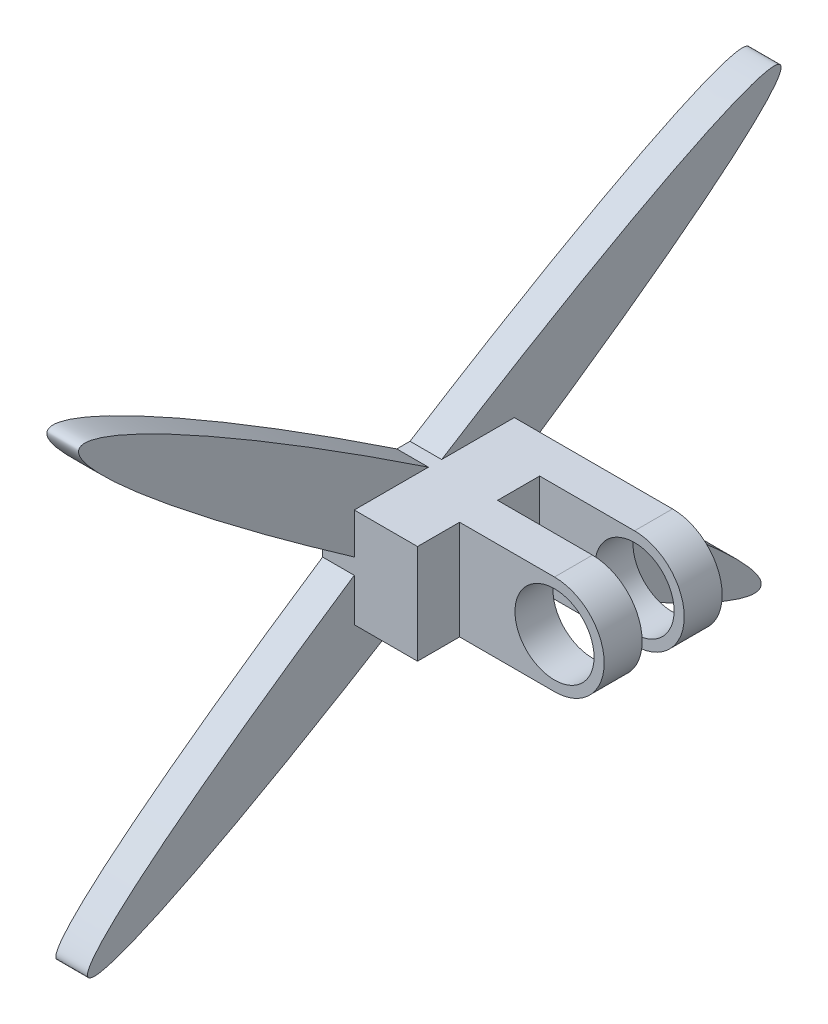
ISO-10303-21;
HEADER;
FILE_DESCRIPTION(('STEP AP214'),'2;1');
FILE_NAME('part.step','',(''),(''),'','','');
FILE_SCHEMA(('AUTOMOTIVE_DESIGN { 1 0 10303 214 1 1 1 1 }'));
ENDSEC;
DATA;
#1=APPLICATION_CONTEXT('core data for automotive mechanical design processes');
#2=APPLICATION_PROTOCOL_DEFINITION('international standard','automotive_design',2000,#1);
#3=PRODUCT_CONTEXT('',#1,'mechanical');
#4=PRODUCT('Part','Part','',(#3));
#5=PRODUCT_RELATED_PRODUCT_CATEGORY('part','',(#4));
#6=PRODUCT_DEFINITION_FORMATION('','',#4);
#7=PRODUCT_DEFINITION_CONTEXT('part definition',#1,'design');
#8=PRODUCT_DEFINITION('design','',#6,#7);
#9=PRODUCT_DEFINITION_SHAPE('','',#8);
#10=(LENGTH_UNIT() NAMED_UNIT(*) SI_UNIT(.MILLI.,.METRE.));
#11=(NAMED_UNIT(*) PLANE_ANGLE_UNIT() SI_UNIT($,.RADIAN.));
#12=(NAMED_UNIT(*) SI_UNIT($,.STERADIAN.) SOLID_ANGLE_UNIT());
#13=UNCERTAINTY_MEASURE_WITH_UNIT(LENGTH_MEASURE(1.E-05),#10,'distance_accuracy_value','');
#14=(GEOMETRIC_REPRESENTATION_CONTEXT(3) GLOBAL_UNCERTAINTY_ASSIGNED_CONTEXT((#13)) GLOBAL_UNIT_ASSIGNED_CONTEXT((#10,
#11,#12)) REPRESENTATION_CONTEXT('',''));
#15=CARTESIAN_POINT('',(0.,0.,0.));
#16=DIRECTION('',(0.,0.,1.));
#17=DIRECTION('',(1.,0.,0.));
#18=AXIS2_PLACEMENT_3D('',#15,#16,#17);
#19=CARTESIAN_POINT('',(5.,-7.85,-0.925790622685157));
#20=DIRECTION('',(0.,1.,0.));
#21=DIRECTION('',(0.,0.,1.));
#22=AXIS2_PLACEMENT_3D('',#19,#20,#21);
#23=PLANE('',#22);
#24=DIRECTION('',(0.,0.,1.));
#25=VECTOR('',#24,1.);
#26=CARTESIAN_POINT('',(30.,-7.85,-30.));
#27=LINE('',#26,#25);
#28=CARTESIAN_POINT('',(30.,-7.85,0.));
#29=VERTEX_POINT('',#28);
#30=CARTESIAN_POINT('',(30.,-7.85,6.));
#31=VERTEX_POINT('',#30);
#32=EDGE_CURVE('E166',#29,#31,#27,.T.);
#33=ORIENTED_EDGE('',*,*,#32,.T.);
#34=DIRECTION('',(1.,0.,0.));
#35=VECTOR('',#34,1.);
#36=CARTESIAN_POINT('',(45.,-7.85,6.));
#37=LINE('',#36,#35);
#38=CARTESIAN_POINT('',(15.,-7.85,6.));
#39=VERTEX_POINT('',#38);
#40=EDGE_CURVE('E178',#39,#31,#37,.T.);
#41=ORIENTED_EDGE('',*,*,#40,.F.);
#42=DIRECTION('',(0.,0.,-1.));
#43=VECTOR('',#42,1.);
#44=CARTESIAN_POINT('',(15.,-7.85,12.65));
#45=LINE('',#44,#43);
#46=CARTESIAN_POINT('',(15.,-7.85,12.65));
#47=VERTEX_POINT('',#46);
#48=EDGE_CURVE('E190',#47,#39,#45,.T.);
#49=ORIENTED_EDGE('',*,*,#48,.F.);
#50=DIRECTION('',(-1.,0.,0.));
#51=VECTOR('',#50,1.);
#52=CARTESIAN_POINT('',(45.,-7.85,12.65));
#53=LINE('',#52,#51);
#54=CARTESIAN_POINT('',(5.,-7.85,12.65));
#55=VERTEX_POINT('',#54);
#56=EDGE_CURVE('E257',#47,#55,#53,.T.);
#57=ORIENTED_EDGE('',*,*,#56,.T.);
#58=DIRECTION('',(0.,0.,-1.));
#59=VECTOR('',#58,1.);
#60=CARTESIAN_POINT('',(5.,-7.85,-12.65));
#61=LINE('',#60,#59);
#62=CARTESIAN_POINT('',(5.,-7.85,1.1634706859199));
#63=VERTEX_POINT('',#62);
#64=EDGE_CURVE('E232',#55,#63,#61,.T.);
#65=ORIENTED_EDGE('',*,*,#64,.T.);
#66=DIRECTION('',(-1.,0.,0.));
#67=VECTOR('',#66,1.);
#68=CARTESIAN_POINT('',(5.,-7.85,1.1634706859199));
#69=LINE('',#68,#67);
#70=CARTESIAN_POINT('',(0.,-7.85,1.1634706859199));
#71=VERTEX_POINT('',#70);
#72=EDGE_CURVE('E335',#63,#71,#69,.T.);
#73=ORIENTED_EDGE('',*,*,#72,.T.);
#74=DIRECTION('',(0.,0.,-1.));
#75=VECTOR('',#74,1.);
#76=CARTESIAN_POINT('',(0.,-7.85,-0.925790622685157));
#77=LINE('',#76,#75);
#78=CARTESIAN_POINT('',(0.,-7.85,-0.92579062268516));
#79=VERTEX_POINT('',#78);
#80=EDGE_CURVE('E416',#71,#79,#77,.T.);
#81=ORIENTED_EDGE('',*,*,#80,.T.);
#82=DIRECTION('',(-1.,0.,0.));
#83=VECTOR('',#82,1.);
#84=CARTESIAN_POINT('',(5.,-7.85,-0.92579062268516));
#85=LINE('',#84,#83);
#86=CARTESIAN_POINT('',(5.,-7.85,-0.92579062268516));
#87=VERTEX_POINT('',#86);
#88=EDGE_CURVE('E341',#87,#79,#85,.T.);
#89=ORIENTED_EDGE('',*,*,#88,.F.);
#90=CARTESIAN_POINT('',(5.,-7.85,-12.65));
#91=VERTEX_POINT('',#90);
#92=EDGE_CURVE('E238',#87,#91,#61,.T.);
#93=ORIENTED_EDGE('',*,*,#92,.T.);
#94=DIRECTION('',(-1.,0.,0.));
#95=VECTOR('',#94,1.);
#96=CARTESIAN_POINT('',(45.,-7.85,-12.65));
#97=LINE('',#96,#95);
#98=CARTESIAN_POINT('',(30.,-7.85,-12.65));
#99=VERTEX_POINT('',#98);
#100=EDGE_CURVE('E254',#99,#91,#97,.T.);
#101=ORIENTED_EDGE('',*,*,#100,.F.);
#102=CARTESIAN_POINT('',(30.,-7.85,-6.65));
#103=VERTEX_POINT('',#102);
#104=EDGE_CURVE('E182',#99,#103,#27,.T.);
#105=ORIENTED_EDGE('',*,*,#104,.T.);
#106=DIRECTION('',(1.,0.,0.));
#107=VECTOR('',#106,1.);
#108=CARTESIAN_POINT('',(45.,-7.85,-6.65));
#109=LINE('',#108,#107);
#110=CARTESIAN_POINT('',(15.,-7.85,-6.65));
#111=VERTEX_POINT('',#110);
#112=EDGE_CURVE('E209',#111,#103,#109,.T.);
#113=ORIENTED_EDGE('',*,*,#112,.F.);
#114=DIRECTION('',(0.,0.,-1.));
#115=VECTOR('',#114,1.);
#116=CARTESIAN_POINT('',(15.,-7.85,0.));
#117=LINE('',#116,#115);
#118=CARTESIAN_POINT('',(15.,-7.85,0.));
#119=VERTEX_POINT('',#118);
#120=EDGE_CURVE('E204',#119,#111,#117,.T.);
#121=ORIENTED_EDGE('',*,*,#120,.F.);
#122=DIRECTION('',(-1.,0.,0.));
#123=VECTOR('',#122,1.);
#124=CARTESIAN_POINT('',(45.,-7.85,0.));
#125=LINE('',#124,#123);
#126=EDGE_CURVE('E180',#29,#119,#125,.T.);
#127=ORIENTED_EDGE('',*,*,#126,.F.);
#128=EDGE_LOOP('',(#33,#41,#49,#57,#65,#73,#81,#89,#93,#101,#105,#113,#121,#127));
#129=FACE_BOUND('',#128,.T.);
#130=ADVANCED_FACE('F39',(#129),#23,.F.);
#131=CARTESIAN_POINT('',(5.,0.,0.));
#132=DIRECTION('',(1.,0.,0.));
#133=DIRECTION('',(0.,0.,-1.));
#134=AXIS2_PLACEMENT_3D('',#131,#132,#133);
#135=PLANE('',#134);
#136=DIRECTION('',(0.,-1.,0.));
#137=VECTOR('',#136,1.);
#138=CARTESIAN_POINT('',(5.,-7.85,12.65));
#139=LINE('',#138,#137);
#140=CARTESIAN_POINT('',(5.,7.84999999999999,12.65));
#141=VERTEX_POINT('',#140);
#142=CARTESIAN_POINT('',(5.,1.41630640420595,12.65));
#143=VERTEX_POINT('',#142);
#144=EDGE_CURVE('E228',#141,#143,#139,.T.);
#145=ORIENTED_EDGE('',*,*,#144,.F.);
#146=DIRECTION('',(0.,0.,1.));
#147=VECTOR('',#146,1.);
#148=CARTESIAN_POINT('',(5.,7.85,-12.65));
#149=LINE('',#148,#147);
#150=CARTESIAN_POINT('',(5.,7.85,0.925790622685158));
#151=VERTEX_POINT('',#150);
#152=EDGE_CURVE('E248',#151,#141,#149,.T.);
#153=ORIENTED_EDGE('',*,*,#152,.F.);
#154=CARTESIAN_POINT('',(5.,0.,0.));
#155=DIRECTION('',(1.,0.,0.));
#156=DIRECTION('',(0.,0.560430060668775,0.828201755068651));
#157=AXIS2_PLACEMENT_3D('',#154,#155,#156);
#158=ELLIPSE('',#157,67.7726952061729,5.99999999999999);
#159=EDGE_CURVE('E260',#151,#143,#158,.T.);
#160=ORIENTED_EDGE('',*,*,#159,.T.);
#161=EDGE_LOOP('',(#145,#153,#160));
#162=FACE_BOUND('',#161,.T.);
#163=ADVANCED_FACE('F289',(#162),#135,.T.);
#164=CARTESIAN_POINT('',(5.,7.85,-12.65));
#165=VERTEX_POINT('',#164);
#166=CARTESIAN_POINT('',(5.,7.85,-1.1634706859199));
#167=VERTEX_POINT('',#166);
#168=EDGE_CURVE('E242',#165,#167,#149,.T.);
#169=ORIENTED_EDGE('',*,*,#168,.F.);
#170=DIRECTION('',(0.,1.,0.));
#171=VECTOR('',#170,1.);
#172=CARTESIAN_POINT('',(5.,-7.85,-12.65));
#173=LINE('',#172,#171);
#174=CARTESIAN_POINT('',(5.,1.0899342993438,-12.65));
#175=VERTEX_POINT('',#174);
#176=EDGE_CURVE('E243',#175,#165,#173,.T.);
#177=ORIENTED_EDGE('',*,*,#176,.F.);
#178=CARTESIAN_POINT('',(5.,0.,0.));
#179=DIRECTION('',(1.,0.,0.));
#180=DIRECTION('',(0.,-0.539700981579857,0.841856787394233));
#181=AXIS2_PLACEMENT_3D('',#178,#179,#180);
#182=ELLIPSE('',#181,65.,6.);
#183=EDGE_CURVE('E365',#175,#167,#182,.T.);
#184=ORIENTED_EDGE('',*,*,#183,.T.);
#185=EDGE_LOOP('',(#169,#177,#184));
#186=FACE_BOUND('',#185,.T.);
#187=ADVANCED_FACE('F293',(#186),#135,.T.);
#188=CARTESIAN_POINT('',(5.,-1.08993429934377,12.65));
#189=VERTEX_POINT('',#188);
#190=EDGE_CURVE('E233',#189,#55,#139,.T.);
#191=ORIENTED_EDGE('',*,*,#190,.F.);
#192=CARTESIAN_POINT('',(5.,0.,0.));
#193=DIRECTION('',(1.,0.,0.));
#194=DIRECTION('',(0.,-0.539700981579857,0.841856787394233));
#195=AXIS2_PLACEMENT_3D('',#192,#193,#194);
#196=ELLIPSE('',#195,65.,6.);
#197=EDGE_CURVE('E264',#189,#63,#196,.T.);
#198=ORIENTED_EDGE('',*,*,#197,.T.);
#199=ORIENTED_EDGE('',*,*,#64,.F.);
#200=EDGE_LOOP('',(#191,#198,#199));
#201=FACE_BOUND('',#200,.T.);
#202=ADVANCED_FACE('F285',(#201),#135,.T.);
#203=DIRECTION('',(-1.,0.,0.));
#204=VECTOR('',#203,1.);
#205=SURFACE_OF_LINEAR_EXTRUSION('',#158,#204);
#206=CARTESIAN_POINT('',(0.,0.,0.));
#207=DIRECTION('',(1.,0.,0.));
#208=DIRECTION('',(0.,0.560430060668775,0.828201755068651));
#209=AXIS2_PLACEMENT_3D('',#206,#207,#208);
#210=ELLIPSE('',#209,67.7726952061729,5.99999999999999);
#211=CARTESIAN_POINT('',(0.,7.85,0.925790622685158));
#212=VERTEX_POINT('',#211);
#213=CARTESIAN_POINT('',(0.,1.41630640420595,12.65));
#214=VERTEX_POINT('',#213);
#215=EDGE_CURVE('E259',#212,#214,#210,.T.);
#216=ORIENTED_EDGE('',*,*,#215,.T.);
#217=DIRECTION('',(-1.,0.,0.));
#218=VECTOR('',#217,1.);
#219=CARTESIAN_POINT('',(5.,1.41630640420595,12.65));
#220=LINE('',#219,#218);
#221=EDGE_CURVE('E334',#143,#214,#220,.T.);
#222=ORIENTED_EDGE('',*,*,#221,.F.);
#223=ORIENTED_EDGE('',*,*,#159,.F.);
#224=DIRECTION('',(-1.,0.,0.));
#225=VECTOR('',#224,1.);
#226=CARTESIAN_POINT('',(5.,7.85,0.925790622685158));
#227=LINE('',#226,#225);
#228=EDGE_CURVE('E349',#151,#212,#227,.T.);
#229=ORIENTED_EDGE('',*,*,#228,.T.);
#230=EDGE_LOOP('',(#216,#222,#223,#229));
#231=FACE_BOUND('',#230,.T.);
#232=ADVANCED_FACE('F41',(#231),#205,.F.);
#233=CARTESIAN_POINT('',(5.,-1.08993429934379,12.65));
#234=DIRECTION('',(0.,0.,-1.));
#235=DIRECTION('',(-1.,0.,0.));
#236=AXIS2_PLACEMENT_3D('',#233,#234,#235);
#237=PLANE('',#236);
#238=ORIENTED_EDGE('',*,*,#56,.F.);
#239=DIRECTION('',(0.,-1.,0.));
#240=VECTOR('',#239,1.);
#241=CARTESIAN_POINT('',(15.,32.15,12.65));
#242=LINE('',#241,#240);
#243=CARTESIAN_POINT('',(15.,7.85,12.65));
#244=VERTEX_POINT('',#243);
#245=EDGE_CURVE('E189',#244,#47,#242,.T.);
#246=ORIENTED_EDGE('',*,*,#245,.F.);
#247=DIRECTION('',(-1.,0.,0.));
#248=VECTOR('',#247,1.);
#249=CARTESIAN_POINT('',(45.,7.84999999999999,12.65));
#250=LINE('',#249,#248);
#251=EDGE_CURVE('E247',#244,#141,#250,.T.);
#252=ORIENTED_EDGE('',*,*,#251,.T.);
#253=ORIENTED_EDGE('',*,*,#144,.T.);
#254=ORIENTED_EDGE('',*,*,#221,.T.);
#255=DIRECTION('',(0.,-1.,0.));
#256=VECTOR('',#255,1.);
#257=CARTESIAN_POINT('',(0.,-1.08993429934379,12.65));
#258=LINE('',#257,#256);
#259=CARTESIAN_POINT('',(0.,-1.08993429934377,12.65));
#260=VERTEX_POINT('',#259);
#261=EDGE_CURVE('E331',#214,#260,#258,.T.);
#262=ORIENTED_EDGE('',*,*,#261,.T.);
#263=DIRECTION('',(-1.,0.,0.));
#264=VECTOR('',#263,1.);
#265=CARTESIAN_POINT('',(5.,-1.08993429934377,12.65));
#266=LINE('',#265,#264);
#267=EDGE_CURVE('E329',#189,#260,#266,.T.);
#268=ORIENTED_EDGE('',*,*,#267,.F.);
#269=ORIENTED_EDGE('',*,*,#190,.T.);
#270=EDGE_LOOP('',(#238,#246,#252,#253,#254,#262,#268,#269));
#271=FACE_BOUND('',#270,.T.);
#272=ADVANCED_FACE('F277',(#271),#237,.F.);
#273=DIRECTION('',(-1.,0.,0.));
#274=VECTOR('',#273,1.);
#275=SURFACE_OF_LINEAR_EXTRUSION('',#196,#274);
#276=CARTESIAN_POINT('',(0.,0.,0.));
#277=DIRECTION('',(1.,0.,0.));
#278=DIRECTION('',(0.,-0.539700981579857,0.841856787394233));
#279=AXIS2_PLACEMENT_3D('',#276,#277,#278);
#280=ELLIPSE('',#279,65.,6.);
#281=EDGE_CURVE('E338',#260,#71,#280,.T.);
#282=ORIENTED_EDGE('',*,*,#281,.T.);
#283=ORIENTED_EDGE('',*,*,#72,.F.);
#284=ORIENTED_EDGE('',*,*,#197,.F.);
#285=ORIENTED_EDGE('',*,*,#267,.T.);
#286=EDGE_LOOP('',(#282,#283,#284,#285));
#287=FACE_BOUND('',#286,.T.);
#288=ADVANCED_FACE('F273',(#287),#275,.F.);
#289=CARTESIAN_POINT('',(5.,0.,0.));
#290=DIRECTION('',(1.,0.,0.));
#291=DIRECTION('',(0.,0.559792927385766,0.828632535234331));
#292=AXIS2_PLACEMENT_3D('',#289,#290,#291);
#293=ELLIPSE('',#292,62.2273143883817,6.00721502544646);
#294=DIRECTION('',(-1.,0.,0.));
#295=VECTOR('',#294,1.);
#296=SURFACE_OF_LINEAR_EXTRUSION('',#293,#295);
#297=CARTESIAN_POINT('',(0.,0.,0.));
#298=DIRECTION('',(1.,0.,0.));
#299=DIRECTION('',(0.,0.559792927385766,0.828632535234331));
#300=AXIS2_PLACEMENT_3D('',#297,#298,#299);
#301=ELLIPSE('',#300,62.2273143883817,6.00721502544646);
#302=CARTESIAN_POINT('',(0.,-1.41630640420595,-12.65));
#303=VERTEX_POINT('',#302);
#304=EDGE_CURVE('E413',#79,#303,#301,.T.);
#305=ORIENTED_EDGE('',*,*,#304,.T.);
#306=DIRECTION('',(-1.,0.,0.));
#307=VECTOR('',#306,1.);
#308=CARTESIAN_POINT('',(5.,-1.41630640420595,-12.65));
#309=LINE('',#308,#307);
#310=CARTESIAN_POINT('',(5.,-1.41630640420595,-12.65));
#311=VERTEX_POINT('',#310);
#312=EDGE_CURVE('E395',#311,#303,#309,.T.);
#313=ORIENTED_EDGE('',*,*,#312,.F.);
#314=EDGE_CURVE('E269',#87,#311,#293,.T.);
#315=ORIENTED_EDGE('',*,*,#314,.F.);
#316=ORIENTED_EDGE('',*,*,#88,.T.);
#317=EDGE_LOOP('',(#305,#313,#315,#316));
#318=FACE_BOUND('',#317,.T.);
#319=ADVANCED_FACE('F276',(#318),#296,.F.);
#320=CARTESIAN_POINT('',(5.,-1.41630640420595,-12.65));
#321=DIRECTION('',(0.,0.,1.));
#322=DIRECTION('',(1.,0.,0.));
#323=AXIS2_PLACEMENT_3D('',#320,#321,#322);
#324=PLANE('',#323);
#325=CARTESIAN_POINT('',(30.,0.,-12.65));
#326=DIRECTION('',(0.,0.,1.));
#327=DIRECTION('',(1.,0.,0.));
#328=AXIS2_PLACEMENT_3D('',#325,#326,#327);
#329=CIRCLE('',#328,6.25);
#330=CARTESIAN_POINT('',(36.25,0.,-12.65));
#331=VERTEX_POINT('',#330);
#332=EDGE_CURVE('E172',#331,#331,#329,.T.);
#333=ORIENTED_EDGE('',*,*,#332,.T.);
#334=EDGE_LOOP('',(#333));
#335=FACE_BOUND('',#334,.T.);
#336=DIRECTION('',(-1.,0.,0.));
#337=VECTOR('',#336,1.);
#338=CARTESIAN_POINT('',(45.,7.85,-12.65));
#339=LINE('',#338,#337);
#340=CARTESIAN_POINT('',(30.,7.85,-12.65));
#341=VERTEX_POINT('',#340);
#342=EDGE_CURVE('E251',#341,#165,#339,.T.);
#343=ORIENTED_EDGE('',*,*,#342,.F.);
#344=CARTESIAN_POINT('',(30.,0.,-12.65));
#345=DIRECTION('',(0.,0.,1.));
#346=DIRECTION('',(1.,0.,0.));
#347=AXIS2_PLACEMENT_3D('',#344,#345,#346);
#348=CIRCLE('',#347,7.85);
#349=EDGE_CURVE('E205',#341,#99,#348,.F.);
#350=ORIENTED_EDGE('',*,*,#349,.T.);
#351=ORIENTED_EDGE('',*,*,#100,.T.);
#352=EDGE_CURVE('E237',#91,#311,#173,.T.);
#353=ORIENTED_EDGE('',*,*,#352,.T.);
#354=ORIENTED_EDGE('',*,*,#312,.T.);
#355=DIRECTION('',(0.,1.,0.));
#356=VECTOR('',#355,1.);
#357=CARTESIAN_POINT('',(0.,-1.41630640420595,-12.65));
#358=LINE('',#357,#356);
#359=CARTESIAN_POINT('',(0.,1.0899342993438,-12.65));
#360=VERTEX_POINT('',#359);
#361=EDGE_CURVE('E410',#303,#360,#358,.T.);
#362=ORIENTED_EDGE('',*,*,#361,.T.);
#363=DIRECTION('',(-1.,0.,0.));
#364=VECTOR('',#363,1.);
#365=CARTESIAN_POINT('',(5.,1.0899342993438,-12.65));
#366=LINE('',#365,#364);
#367=EDGE_CURVE('E362',#175,#360,#366,.T.);
#368=ORIENTED_EDGE('',*,*,#367,.F.);
#369=ORIENTED_EDGE('',*,*,#176,.T.);
#370=EDGE_LOOP('',(#343,#350,#351,#353,#354,#362,#368,#369));
#371=FACE_BOUND('',#370,.T.);
#372=ADVANCED_FACE('F359',(#335,#371),#324,.F.);
#373=DIRECTION('',(-1.,0.,0.));
#374=VECTOR('',#373,1.);
#375=SURFACE_OF_LINEAR_EXTRUSION('',#182,#374);
#376=CARTESIAN_POINT('',(0.,0.,0.));
#377=DIRECTION('',(1.,0.,0.));
#378=DIRECTION('',(0.,-0.539700981579857,0.841856787394233));
#379=AXIS2_PLACEMENT_3D('',#376,#377,#378);
#380=ELLIPSE('',#379,65.,6.);
#381=CARTESIAN_POINT('',(0.,7.85,-1.1634706859199));
#382=VERTEX_POINT('',#381);
#383=EDGE_CURVE('E407',#360,#382,#380,.T.);
#384=ORIENTED_EDGE('',*,*,#383,.T.);
#385=DIRECTION('',(-1.,0.,0.));
#386=VECTOR('',#385,1.);
#387=CARTESIAN_POINT('',(5.,7.85,-1.1634706859199));
#388=LINE('',#387,#386);
#389=EDGE_CURVE('E368',#167,#382,#388,.T.);
#390=ORIENTED_EDGE('',*,*,#389,.F.);
#391=ORIENTED_EDGE('',*,*,#183,.F.);
#392=ORIENTED_EDGE('',*,*,#367,.T.);
#393=EDGE_LOOP('',(#384,#390,#391,#392));
#394=FACE_BOUND('',#393,.T.);
#395=ADVANCED_FACE('F314',(#394),#375,.F.);
#396=CARTESIAN_POINT('',(5.,7.85,-1.1634706859199));
#397=DIRECTION('',(0.,-1.,0.));
#398=DIRECTION('',(0.,0.,-1.));
#399=AXIS2_PLACEMENT_3D('',#396,#397,#398);
#400=PLANE('',#399);
#401=DIRECTION('',(1.,0.,0.));
#402=VECTOR('',#401,1.);
#403=CARTESIAN_POINT('',(5.,7.85,6.));
#404=LINE('',#403,#402);
#405=CARTESIAN_POINT('',(15.,7.85,6.));
#406=VERTEX_POINT('',#405);
#407=CARTESIAN_POINT('',(30.,7.85,6.));
#408=VERTEX_POINT('',#407);
#409=EDGE_CURVE('E225',#406,#408,#404,.T.);
#410=ORIENTED_EDGE('',*,*,#409,.T.);
#411=DIRECTION('',(0.,0.,1.));
#412=VECTOR('',#411,1.);
#413=CARTESIAN_POINT('',(30.,7.85,-30.));
#414=LINE('',#413,#412);
#415=CARTESIAN_POINT('',(30.,7.85,0.));
#416=VERTEX_POINT('',#415);
#417=EDGE_CURVE('E64',#416,#408,#414,.T.);
#418=ORIENTED_EDGE('',*,*,#417,.F.);
#419=DIRECTION('',(-1.,0.,0.));
#420=VECTOR('',#419,1.);
#421=CARTESIAN_POINT('',(5.,7.85,0.));
#422=LINE('',#421,#420);
#423=CARTESIAN_POINT('',(15.,7.85,0.));
#424=VERTEX_POINT('',#423);
#425=EDGE_CURVE('E200',#416,#424,#422,.T.);
#426=ORIENTED_EDGE('',*,*,#425,.T.);
#427=DIRECTION('',(0.,0.,-1.));
#428=VECTOR('',#427,1.);
#429=CARTESIAN_POINT('',(15.,7.85,-1.1634706859199));
#430=LINE('',#429,#428);
#431=CARTESIAN_POINT('',(15.,7.85,-6.65));
#432=VERTEX_POINT('',#431);
#433=EDGE_CURVE('E49',#424,#432,#430,.T.);
#434=ORIENTED_EDGE('',*,*,#433,.T.);
#435=DIRECTION('',(1.,0.,0.));
#436=VECTOR('',#435,1.);
#437=CARTESIAN_POINT('',(5.,7.85,-6.65));
#438=LINE('',#437,#436);
#439=CARTESIAN_POINT('',(30.,7.85,-6.65));
#440=VERTEX_POINT('',#439);
#441=EDGE_CURVE('E221',#432,#440,#438,.T.);
#442=ORIENTED_EDGE('',*,*,#441,.T.);
#443=EDGE_CURVE('E56',#341,#440,#414,.T.);
#444=ORIENTED_EDGE('',*,*,#443,.F.);
#445=ORIENTED_EDGE('',*,*,#342,.T.);
#446=ORIENTED_EDGE('',*,*,#168,.T.);
#447=ORIENTED_EDGE('',*,*,#389,.T.);
#448=DIRECTION('',(0.,0.,1.));
#449=VECTOR('',#448,1.);
#450=CARTESIAN_POINT('',(0.,7.85,-1.1634706859199));
#451=LINE('',#450,#449);
#452=EDGE_CURVE('E265',#382,#212,#451,.T.);
#453=ORIENTED_EDGE('',*,*,#452,.T.);
#454=ORIENTED_EDGE('',*,*,#228,.F.);
#455=ORIENTED_EDGE('',*,*,#152,.T.);
#456=ORIENTED_EDGE('',*,*,#251,.F.);
#457=DIRECTION('',(0.,0.,-1.));
#458=VECTOR('',#457,1.);
#459=CARTESIAN_POINT('',(15.,7.85,-1.1634706859199));
#460=LINE('',#459,#458);
#461=EDGE_CURVE('E11',#244,#406,#460,.T.);
#462=ORIENTED_EDGE('',*,*,#461,.T.);
#463=EDGE_LOOP('',(#410,#418,#426,#434,#442,#444,#445,#446,#447,#453,#454,#455,#456,#462));
#464=FACE_BOUND('',#463,.T.);
#465=ADVANCED_FACE('F306',(#464),#400,.F.);
#466=ORIENTED_EDGE('',*,*,#352,.F.);
#467=ORIENTED_EDGE('',*,*,#92,.F.);
#468=ORIENTED_EDGE('',*,*,#314,.T.);
#469=EDGE_LOOP('',(#466,#467,#468));
#470=FACE_BOUND('',#469,.T.);
#471=ADVANCED_FACE('F296',(#470),#135,.T.);
#472=CARTESIAN_POINT('',(0.,0.,0.));
#473=DIRECTION('',(1.,0.,0.));
#474=DIRECTION('',(0.,0.,-1.));
#475=AXIS2_PLACEMENT_3D('',#472,#473,#474);
#476=PLANE('',#475);
#477=ORIENTED_EDGE('',*,*,#215,.F.);
#478=ORIENTED_EDGE('',*,*,#452,.F.);
#479=ORIENTED_EDGE('',*,*,#383,.F.);
#480=ORIENTED_EDGE('',*,*,#361,.F.);
#481=ORIENTED_EDGE('',*,*,#304,.F.);
#482=ORIENTED_EDGE('',*,*,#80,.F.);
#483=ORIENTED_EDGE('',*,*,#281,.F.);
#484=ORIENTED_EDGE('',*,*,#261,.F.);
#485=EDGE_LOOP('',(#477,#478,#479,#480,#481,#482,#483,#484));
#486=FACE_BOUND('',#485,.T.);
#487=ADVANCED_FACE('F305',(#486),#476,.F.);
#488=CARTESIAN_POINT('',(15.,32.15,0.));
#489=DIRECTION('',(-1.,0.,0.));
#490=DIRECTION('',(0.,0.,1.));
#491=AXIS2_PLACEMENT_3D('',#488,#489,#490);
#492=PLANE('',#491);
#493=DIRECTION('',(0.,-1.,0.));
#494=VECTOR('',#493,1.);
#495=CARTESIAN_POINT('',(15.,32.15,0.));
#496=LINE('',#495,#494);
#497=EDGE_CURVE('E213',#424,#119,#496,.T.);
#498=ORIENTED_EDGE('',*,*,#497,.T.);
#499=ORIENTED_EDGE('',*,*,#120,.T.);
#500=DIRECTION('',(0.,-1.,0.));
#501=VECTOR('',#500,1.);
#502=CARTESIAN_POINT('',(15.,32.15,-6.65));
#503=LINE('',#502,#501);
#504=EDGE_CURVE('E195',#432,#111,#503,.T.);
#505=ORIENTED_EDGE('',*,*,#504,.F.);
#506=ORIENTED_EDGE('',*,*,#433,.F.);
#507=EDGE_LOOP('',(#498,#499,#505,#506));
#508=FACE_BOUND('',#507,.T.);
#509=ADVANCED_FACE('F312',(#508),#492,.F.);
#510=CARTESIAN_POINT('',(45.,32.15,-6.64999999999999));
#511=DIRECTION('',(0.,0.,-1.));
#512=DIRECTION('',(0.,1.,0.));
#513=AXIS2_PLACEMENT_3D('',#510,#511,#512);
#514=PLANE('',#513);
#515=CARTESIAN_POINT('',(30.,0.,-6.65));
#516=DIRECTION('',(0.,0.,-1.));
#517=DIRECTION('',(0.,1.,0.));
#518=AXIS2_PLACEMENT_3D('',#515,#516,#517);
#519=CIRCLE('',#518,6.25);
#520=CARTESIAN_POINT('',(30.,6.25,-6.65));
#521=VERTEX_POINT('',#520);
#522=EDGE_CURVE('E534',#521,#521,#519,.T.);
#523=ORIENTED_EDGE('',*,*,#522,.T.);
#524=EDGE_LOOP('',(#523));
#525=FACE_BOUND('',#524,.T.);
#526=ORIENTED_EDGE('',*,*,#112,.T.);
#527=CARTESIAN_POINT('',(30.,0.,-6.65));
#528=DIRECTION('',(0.,0.,-1.));
#529=DIRECTION('',(0.,1.,0.));
#530=AXIS2_PLACEMENT_3D('',#527,#528,#529);
#531=CIRCLE('',#530,7.85);
#532=EDGE_CURVE('E377',#103,#440,#531,.F.);
#533=ORIENTED_EDGE('',*,*,#532,.T.);
#534=ORIENTED_EDGE('',*,*,#441,.F.);
#535=ORIENTED_EDGE('',*,*,#504,.T.);
#536=EDGE_LOOP('',(#526,#533,#534,#535));
#537=FACE_BOUND('',#536,.T.);
#538=ADVANCED_FACE('F512',(#525,#537),#514,.F.);
#539=CARTESIAN_POINT('',(45.,32.15,0.));
#540=DIRECTION('',(0.,0.,1.));
#541=DIRECTION('',(0.,-1.,0.));
#542=AXIS2_PLACEMENT_3D('',#539,#540,#541);
#543=PLANE('',#542);
#544=CARTESIAN_POINT('',(30.,0.,0.));
#545=DIRECTION('',(0.,0.,1.));
#546=DIRECTION('',(0.,-1.,0.));
#547=AXIS2_PLACEMENT_3D('',#544,#545,#546);
#548=CIRCLE('',#547,6.25);
#549=CARTESIAN_POINT('',(30.,-6.25,0.));
#550=VERTEX_POINT('',#549);
#551=EDGE_CURVE('E525',#550,#550,#548,.T.);
#552=ORIENTED_EDGE('',*,*,#551,.T.);
#553=EDGE_LOOP('',(#552));
#554=FACE_BOUND('',#553,.T.);
#555=ORIENTED_EDGE('',*,*,#425,.F.);
#556=CARTESIAN_POINT('',(30.,0.,0.));
#557=DIRECTION('',(0.,0.,1.));
#558=DIRECTION('',(0.,-1.,0.));
#559=AXIS2_PLACEMENT_3D('',#556,#557,#558);
#560=CIRCLE('',#559,7.85);
#561=EDGE_CURVE('E374',#416,#29,#560,.F.);
#562=ORIENTED_EDGE('',*,*,#561,.T.);
#563=ORIENTED_EDGE('',*,*,#126,.T.);
#564=ORIENTED_EDGE('',*,*,#497,.F.);
#565=EDGE_LOOP('',(#555,#562,#563,#564));
#566=FACE_BOUND('',#565,.T.);
#567=ADVANCED_FACE('F511',(#554,#566),#543,.F.);
#568=CARTESIAN_POINT('',(15.,32.15,12.65));
#569=DIRECTION('',(-1.,0.,0.));
#570=DIRECTION('',(0.,0.,1.));
#571=AXIS2_PLACEMENT_3D('',#568,#569,#570);
#572=PLANE('',#571);
#573=ORIENTED_EDGE('',*,*,#245,.T.);
#574=ORIENTED_EDGE('',*,*,#48,.T.);
#575=DIRECTION('',(0.,-1.,0.));
#576=VECTOR('',#575,1.);
#577=CARTESIAN_POINT('',(15.,32.15,6.));
#578=LINE('',#577,#576);
#579=EDGE_CURVE('E186',#406,#39,#578,.T.);
#580=ORIENTED_EDGE('',*,*,#579,.F.);
#581=ORIENTED_EDGE('',*,*,#461,.F.);
#582=EDGE_LOOP('',(#573,#574,#580,#581));
#583=FACE_BOUND('',#582,.T.);
#584=ADVANCED_FACE('F507',(#583),#572,.F.);
#585=CARTESIAN_POINT('',(45.,32.15,6.00000000000001));
#586=DIRECTION('',(0.,0.,-1.));
#587=DIRECTION('',(0.,1.,0.));
#588=AXIS2_PLACEMENT_3D('',#585,#586,#587);
#589=PLANE('',#588);
#590=CARTESIAN_POINT('',(30.,0.,6.));
#591=DIRECTION('',(0.,0.,1.));
#592=DIRECTION('',(1.,0.,0.));
#593=AXIS2_PLACEMENT_3D('',#590,#591,#592);
#594=CIRCLE('',#593,6.25);
#595=CARTESIAN_POINT('',(36.25,0.,6.));
#596=VERTEX_POINT('',#595);
#597=EDGE_CURVE('E535',#596,#596,#594,.T.);
#598=ORIENTED_EDGE('',*,*,#597,.F.);
#599=EDGE_LOOP('',(#598));
#600=FACE_BOUND('',#599,.T.);
#601=ORIENTED_EDGE('',*,*,#40,.T.);
#602=CARTESIAN_POINT('',(30.,0.,6.));
#603=DIRECTION('',(0.,0.,-1.));
#604=DIRECTION('',(-1.,0.,0.));
#605=AXIS2_PLACEMENT_3D('',#602,#603,#604);
#606=CIRCLE('',#605,7.85);
#607=EDGE_CURVE('E163',#408,#31,#606,.T.);
#608=ORIENTED_EDGE('',*,*,#607,.F.);
#609=ORIENTED_EDGE('',*,*,#409,.F.);
#610=ORIENTED_EDGE('',*,*,#579,.T.);
#611=EDGE_LOOP('',(#601,#608,#609,#610));
#612=FACE_BOUND('',#611,.T.);
#613=ADVANCED_FACE('F184',(#600,#612),#589,.F.);
#614=CARTESIAN_POINT('',(30.,0.,-30.));
#615=DIRECTION('',(0.,0.,1.));
#616=DIRECTION('',(1.,0.,0.));
#617=AXIS2_PLACEMENT_3D('',#614,#615,#616);
#618=CYLINDRICAL_SURFACE('',#617,7.85);
#619=ORIENTED_EDGE('',*,*,#417,.T.);
#620=ORIENTED_EDGE('',*,*,#607,.T.);
#621=ORIENTED_EDGE('',*,*,#32,.F.);
#622=ORIENTED_EDGE('',*,*,#561,.F.);
#623=EDGE_LOOP('',(#619,#620,#621,#622));
#624=FACE_BOUND('',#623,.T.);
#625=ADVANCED_FACE('F165',(#624),#618,.T.);
#626=ORIENTED_EDGE('',*,*,#443,.T.);
#627=ORIENTED_EDGE('',*,*,#532,.F.);
#628=ORIENTED_EDGE('',*,*,#104,.F.);
#629=ORIENTED_EDGE('',*,*,#349,.F.);
#630=EDGE_LOOP('',(#626,#627,#628,#629));
#631=FACE_BOUND('',#630,.T.);
#632=ADVANCED_FACE('F471',(#631),#618,.T.);
#633=CARTESIAN_POINT('',(30.,0.,-29.));
#634=DIRECTION('',(0.,0.,1.));
#635=DIRECTION('',(1.,0.,0.));
#636=AXIS2_PLACEMENT_3D('',#633,#634,#635);
#637=CYLINDRICAL_SURFACE('',#636,6.25);
#638=ORIENTED_EDGE('',*,*,#597,.T.);
#639=EDGE_LOOP('',(#638));
#640=FACE_BOUND('',#639,.T.);
#641=ORIENTED_EDGE('',*,*,#551,.F.);
#642=EDGE_LOOP('',(#641));
#643=FACE_BOUND('',#642,.T.);
#644=ADVANCED_FACE('F480',(#640,#643),#637,.F.);
#645=ORIENTED_EDGE('',*,*,#522,.F.);
#646=EDGE_LOOP('',(#645));
#647=FACE_BOUND('',#646,.T.);
#648=ORIENTED_EDGE('',*,*,#332,.F.);
#649=EDGE_LOOP('',(#648));
#650=FACE_BOUND('',#649,.T.);
#651=ADVANCED_FACE('F489',(#647,#650),#637,.F.);
#652=CLOSED_SHELL('',(#130,#163,#187,#202,#232,#272,#288,#319,#372,#395,#465,#471,#487,#509,
#538,#567,#584,#613,#625,#632,#644,#651));
#653=MANIFOLD_SOLID_BREP('B2',#652);
#654=ADVANCED_BREP_SHAPE_REPRESENTATION('',(#18,#653),#14);
#655=SHAPE_DEFINITION_REPRESENTATION(#9,#654);
ENDSEC;
END-ISO-10303-21;
